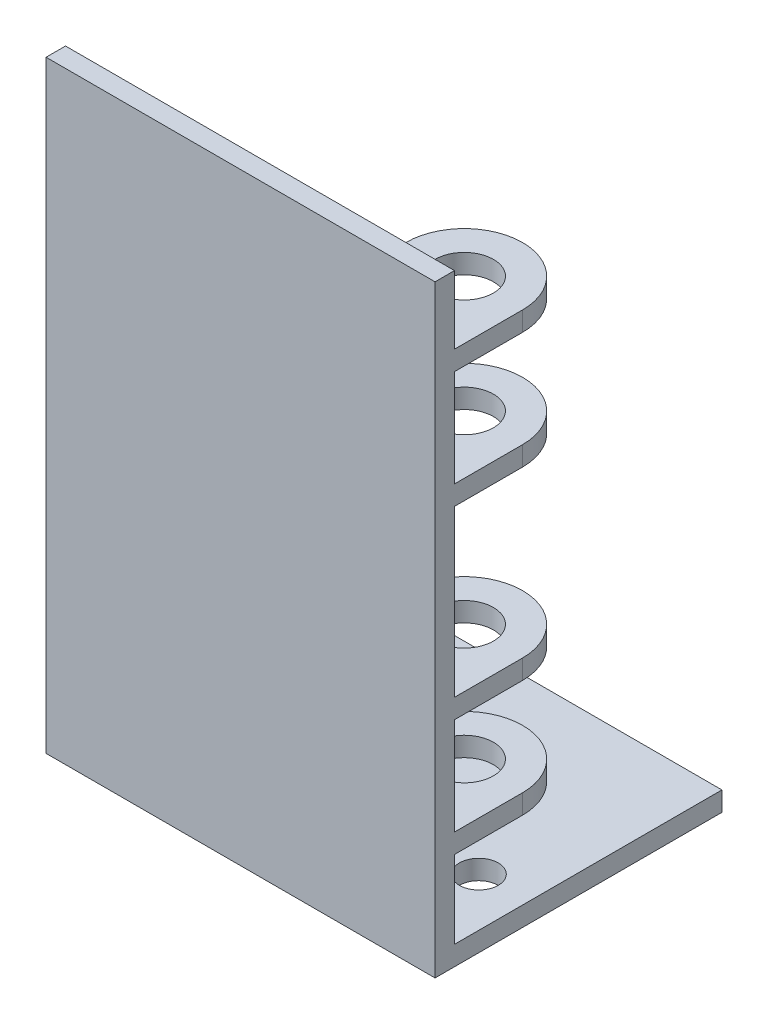
ISO-10303-21;
HEADER;
FILE_DESCRIPTION(('STEP AP214'),'2;1');
FILE_NAME('part.step','',(''),(''),'','','');
FILE_SCHEMA(('AUTOMOTIVE_DESIGN { 1 0 10303 214 1 1 1 1 }'));
ENDSEC;
DATA;
#1=APPLICATION_CONTEXT('core data for automotive mechanical design processes');
#2=APPLICATION_PROTOCOL_DEFINITION('international standard','automotive_design',2000,#1);
#3=PRODUCT_CONTEXT('',#1,'mechanical');
#4=PRODUCT('Part','Part','',(#3));
#5=PRODUCT_RELATED_PRODUCT_CATEGORY('part','',(#4));
#6=PRODUCT_DEFINITION_FORMATION('','',#4);
#7=PRODUCT_DEFINITION_CONTEXT('part definition',#1,'design');
#8=PRODUCT_DEFINITION('design','',#6,#7);
#9=PRODUCT_DEFINITION_SHAPE('','',#8);
#10=(LENGTH_UNIT() NAMED_UNIT(*) SI_UNIT(.MILLI.,.METRE.));
#11=(NAMED_UNIT(*) PLANE_ANGLE_UNIT() SI_UNIT($,.RADIAN.));
#12=(NAMED_UNIT(*) SI_UNIT($,.STERADIAN.) SOLID_ANGLE_UNIT());
#13=UNCERTAINTY_MEASURE_WITH_UNIT(LENGTH_MEASURE(1.E-05),#10,'distance_accuracy_value','');
#14=(GEOMETRIC_REPRESENTATION_CONTEXT(3) GLOBAL_UNCERTAINTY_ASSIGNED_CONTEXT((#13)) GLOBAL_UNIT_ASSIGNED_CONTEXT((#10,
#11,#12)) REPRESENTATION_CONTEXT('',''));
#15=CARTESIAN_POINT('',(0.,0.,0.));
#16=DIRECTION('',(0.,0.,1.));
#17=DIRECTION('',(1.,0.,0.));
#18=AXIS2_PLACEMENT_3D('',#15,#16,#17);
#19=CARTESIAN_POINT('',(0.,2.,0.));
#20=DIRECTION('',(0.,-1.,0.));
#21=DIRECTION('',(0.,0.,-1.));
#22=AXIS2_PLACEMENT_3D('',#19,#20,#21);
#23=PLANE('',#22);
#24=DIRECTION('',(0.,0.,-1.));
#25=VECTOR('',#24,1.);
#26=CARTESIAN_POINT('',(40.,2.,0.));
#27=LINE('',#26,#25);
#28=CARTESIAN_POINT('',(40.,2.,0.));
#29=VERTEX_POINT('',#28);
#30=CARTESIAN_POINT('',(40.,2.,-27.4999999999999));
#31=VERTEX_POINT('',#30);
#32=EDGE_CURVE('E11',#29,#31,#27,.T.);
#33=ORIENTED_EDGE('',*,*,#32,.T.);
#34=DIRECTION('',(1.,0.,0.));
#35=VECTOR('',#34,1.);
#36=CARTESIAN_POINT('',(0.,2.,-27.4999999999999));
#37=LINE('',#36,#35);
#38=CARTESIAN_POINT('',(0.,2.,-27.4999999999999));
#39=VERTEX_POINT('',#38);
#40=EDGE_CURVE('E269',#39,#31,#37,.T.);
#41=ORIENTED_EDGE('',*,*,#40,.F.);
#42=DIRECTION('',(0.,0.,1.));
#43=VECTOR('',#42,1.);
#44=CARTESIAN_POINT('',(0.,2.,0.));
#45=LINE('',#44,#43);
#46=CARTESIAN_POINT('',(0.,2.00000000000002,0.));
#47=VERTEX_POINT('',#46);
#48=EDGE_CURVE('E386',#39,#47,#45,.T.);
#49=ORIENTED_EDGE('',*,*,#48,.T.);
#50=DIRECTION('',(1.,0.,0.));
#51=VECTOR('',#50,1.);
#52=CARTESIAN_POINT('',(0.,2.,0.));
#53=LINE('',#52,#51);
#54=EDGE_CURVE('E52',#47,#29,#53,.T.);
#55=ORIENTED_EDGE('',*,*,#54,.T.);
#56=EDGE_LOOP('',(#33,#41,#49,#55));
#57=FACE_BOUND('',#56,.T.);
#58=CARTESIAN_POINT('',(35.,2.,-7.5));
#59=DIRECTION('',(0.,1.,0.));
#60=DIRECTION('',(0.,0.,1.));
#61=AXIS2_PLACEMENT_3D('',#58,#59,#60);
#62=CIRCLE('',#61,2.);
#63=CARTESIAN_POINT('',(35.,2.,-5.5));
#64=VERTEX_POINT('',#63);
#65=EDGE_CURVE('E379',#64,#64,#62,.T.);
#66=ORIENTED_EDGE('',*,*,#65,.F.);
#67=EDGE_LOOP('',(#66));
#68=FACE_BOUND('',#67,.T.);
#69=CARTESIAN_POINT('',(5.,2.,-7.5));
#70=DIRECTION('',(0.,1.,0.));
#71=DIRECTION('',(0.,0.,1.));
#72=AXIS2_PLACEMENT_3D('',#69,#70,#71);
#73=CIRCLE('',#72,2.);
#74=CARTESIAN_POINT('',(5.,2.,-5.5));
#75=VERTEX_POINT('',#74);
#76=EDGE_CURVE('E372',#75,#75,#73,.T.);
#77=ORIENTED_EDGE('',*,*,#76,.F.);
#78=EDGE_LOOP('',(#77));
#79=FACE_BOUND('',#78,.T.);
#80=ADVANCED_FACE('F43',(#57,#68,#79),#23,.F.);
#81=CARTESIAN_POINT('',(0.,0.,0.));
#82=DIRECTION('',(0.,-1.,0.));
#83=DIRECTION('',(0.,0.,-1.));
#84=AXIS2_PLACEMENT_3D('',#81,#82,#83);
#85=PLANE('',#84);
#86=DIRECTION('',(1.,0.,0.));
#87=VECTOR('',#86,1.);
#88=CARTESIAN_POINT('',(0.,0.,-27.4999999999999));
#89=LINE('',#88,#87);
#90=CARTESIAN_POINT('',(0.,0.,-27.4999999999999));
#91=VERTEX_POINT('',#90);
#92=CARTESIAN_POINT('',(40.,0.,-27.4999999999999));
#93=VERTEX_POINT('',#92);
#94=EDGE_CURVE('E270',#91,#93,#89,.T.);
#95=ORIENTED_EDGE('',*,*,#94,.T.);
#96=DIRECTION('',(0.,0.,-1.));
#97=VECTOR('',#96,1.);
#98=CARTESIAN_POINT('',(40.,0.,0.));
#99=LINE('',#98,#97);
#100=CARTESIAN_POINT('',(40.,0.,2.));
#101=VERTEX_POINT('',#100);
#102=EDGE_CURVE('E47',#101,#93,#99,.T.);
#103=ORIENTED_EDGE('',*,*,#102,.F.);
#104=DIRECTION('',(1.,0.,0.));
#105=VECTOR('',#104,1.);
#106=CARTESIAN_POINT('',(0.,0.,2.));
#107=LINE('',#106,#105);
#108=CARTESIAN_POINT('',(0.,0.,2.));
#109=VERTEX_POINT('',#108);
#110=EDGE_CURVE('E353',#109,#101,#107,.T.);
#111=ORIENTED_EDGE('',*,*,#110,.F.);
#112=DIRECTION('',(0.,0.,1.));
#113=VECTOR('',#112,1.);
#114=CARTESIAN_POINT('',(0.,0.,0.));
#115=LINE('',#114,#113);
#116=EDGE_CURVE('E383',#91,#109,#115,.T.);
#117=ORIENTED_EDGE('',*,*,#116,.F.);
#118=EDGE_LOOP('',(#95,#103,#111,#117));
#119=FACE_BOUND('',#118,.T.);
#120=CARTESIAN_POINT('',(35.,0.,-7.5));
#121=DIRECTION('',(0.,1.,0.));
#122=DIRECTION('',(0.,0.,1.));
#123=AXIS2_PLACEMENT_3D('',#120,#121,#122);
#124=CIRCLE('',#123,2.);
#125=CARTESIAN_POINT('',(35.,0.,-5.5));
#126=VERTEX_POINT('',#125);
#127=EDGE_CURVE('E376',#126,#126,#124,.T.);
#128=ORIENTED_EDGE('',*,*,#127,.T.);
#129=EDGE_LOOP('',(#128));
#130=FACE_BOUND('',#129,.T.);
#131=CARTESIAN_POINT('',(5.,0.,-7.5));
#132=DIRECTION('',(0.,1.,0.));
#133=DIRECTION('',(0.,0.,1.));
#134=AXIS2_PLACEMENT_3D('',#131,#132,#133);
#135=CIRCLE('',#134,2.);
#136=CARTESIAN_POINT('',(5.,0.,-5.5));
#137=VERTEX_POINT('',#136);
#138=EDGE_CURVE('E371',#137,#137,#135,.T.);
#139=ORIENTED_EDGE('',*,*,#138,.T.);
#140=EDGE_LOOP('',(#139));
#141=FACE_BOUND('',#140,.T.);
#142=ADVANCED_FACE('F399',(#119,#130,#141),#85,.T.);
#143=CARTESIAN_POINT('',(0.,2.,0.));
#144=DIRECTION('',(1.,0.,0.));
#145=DIRECTION('',(0.,0.,-1.));
#146=AXIS2_PLACEMENT_3D('',#143,#144,#145);
#147=PLANE('',#146);
#148=ORIENTED_EDGE('',*,*,#48,.F.);
#149=DIRECTION('',(0.,1.,0.));
#150=VECTOR('',#149,1.);
#151=CARTESIAN_POINT('',(0.,0.,-27.4999999999999));
#152=LINE('',#151,#150);
#153=EDGE_CURVE('E273',#91,#39,#152,.T.);
#154=ORIENTED_EDGE('',*,*,#153,.F.);
#155=ORIENTED_EDGE('',*,*,#116,.T.);
#156=DIRECTION('',(0.,-1.,0.));
#157=VECTOR('',#156,1.);
#158=CARTESIAN_POINT('',(0.,42.,2.));
#159=LINE('',#158,#157);
#160=CARTESIAN_POINT('',(0.,62.,2.));
#161=VERTEX_POINT('',#160);
#162=EDGE_CURVE('E368',#161,#109,#159,.T.);
#163=ORIENTED_EDGE('',*,*,#162,.F.);
#164=DIRECTION('',(0.,0.,1.));
#165=VECTOR('',#164,1.);
#166=CARTESIAN_POINT('',(0.,62.,0.));
#167=LINE('',#166,#165);
#168=CARTESIAN_POINT('',(0.,62.,0.));
#169=VERTEX_POINT('',#168);
#170=EDGE_CURVE('E260',#169,#161,#167,.T.);
#171=ORIENTED_EDGE('',*,*,#170,.F.);
#172=DIRECTION('',(0.,-1.,0.));
#173=VECTOR('',#172,1.);
#174=CARTESIAN_POINT('',(0.,42.,0.));
#175=LINE('',#174,#173);
#176=EDGE_CURVE('E356',#169,#47,#175,.T.);
#177=ORIENTED_EDGE('',*,*,#176,.T.);
#178=EDGE_LOOP('',(#148,#154,#155,#163,#171,#177));
#179=FACE_BOUND('',#178,.T.);
#180=ADVANCED_FACE('F45',(#179),#147,.F.);
#181=CARTESIAN_POINT('',(40.,2.,0.));
#182=DIRECTION('',(-1.,0.,0.));
#183=DIRECTION('',(0.,0.,1.));
#184=AXIS2_PLACEMENT_3D('',#181,#182,#183);
#185=PLANE('',#184);
#186=ORIENTED_EDGE('',*,*,#102,.T.);
#187=DIRECTION('',(0.,1.,0.));
#188=VECTOR('',#187,1.);
#189=CARTESIAN_POINT('',(40.,0.,-27.4999999999999));
#190=LINE('',#189,#188);
#191=EDGE_CURVE('E275',#93,#31,#190,.T.);
#192=ORIENTED_EDGE('',*,*,#191,.T.);
#193=ORIENTED_EDGE('',*,*,#32,.F.);
#194=DIRECTION('',(0.,-1.,0.));
#195=VECTOR('',#194,1.);
#196=CARTESIAN_POINT('',(40.,42.,0.));
#197=LINE('',#196,#195);
#198=CARTESIAN_POINT('',(40.,10.,0.));
#199=VERTEX_POINT('',#198);
#200=EDGE_CURVE('E359',#199,#29,#197,.T.);
#201=ORIENTED_EDGE('',*,*,#200,.F.);
#202=DIRECTION('',(0.,0.,-1.));
#203=VECTOR('',#202,1.);
#204=CARTESIAN_POINT('',(40.,10.,-7.));
#205=LINE('',#204,#203);
#206=CARTESIAN_POINT('',(40.,10.,-7.));
#207=VERTEX_POINT('',#206);
#208=EDGE_CURVE('E290',#199,#207,#205,.T.);
#209=ORIENTED_EDGE('',*,*,#208,.T.);
#210=DIRECTION('',(0.,-1.,0.));
#211=VECTOR('',#210,1.);
#212=CARTESIAN_POINT('',(40.,12.,-7.));
#213=LINE('',#212,#211);
#214=CARTESIAN_POINT('',(40.,12.,-7.));
#215=VERTEX_POINT('',#214);
#216=EDGE_CURVE('E298',#215,#207,#213,.T.);
#217=ORIENTED_EDGE('',*,*,#216,.F.);
#218=DIRECTION('',(0.,0.,-1.));
#219=VECTOR('',#218,1.);
#220=CARTESIAN_POINT('',(40.,12.,-7.));
#221=LINE('',#220,#219);
#222=CARTESIAN_POINT('',(40.,12.,0.));
#223=VERTEX_POINT('',#222);
#224=EDGE_CURVE('E296',#223,#215,#221,.T.);
#225=ORIENTED_EDGE('',*,*,#224,.F.);
#226=CARTESIAN_POINT('',(40.,22.,0.));
#227=VERTEX_POINT('',#226);
#228=EDGE_CURVE('E365',#227,#223,#197,.T.);
#229=ORIENTED_EDGE('',*,*,#228,.F.);
#230=DIRECTION('',(0.,0.,-1.));
#231=VECTOR('',#230,1.);
#232=CARTESIAN_POINT('',(40.,22.,-7.));
#233=LINE('',#232,#231);
#234=CARTESIAN_POINT('',(40.,22.,-7.));
#235=VERTEX_POINT('',#234);
#236=EDGE_CURVE('E328',#227,#235,#233,.T.);
#237=ORIENTED_EDGE('',*,*,#236,.T.);
#238=DIRECTION('',(0.,-1.,0.));
#239=VECTOR('',#238,1.);
#240=CARTESIAN_POINT('',(40.,24.,-7.));
#241=LINE('',#240,#239);
#242=CARTESIAN_POINT('',(40.,24.,-7.));
#243=VERTEX_POINT('',#242);
#244=EDGE_CURVE('E336',#243,#235,#241,.T.);
#245=ORIENTED_EDGE('',*,*,#244,.F.);
#246=DIRECTION('',(0.,0.,-1.));
#247=VECTOR('',#246,1.);
#248=CARTESIAN_POINT('',(40.,24.,-7.));
#249=LINE('',#248,#247);
#250=CARTESIAN_POINT('',(40.,24.,0.));
#251=VERTEX_POINT('',#250);
#252=EDGE_CURVE('E334',#251,#243,#249,.T.);
#253=ORIENTED_EDGE('',*,*,#252,.F.);
#254=CARTESIAN_POINT('',(40.,41.,0.));
#255=VERTEX_POINT('',#254);
#256=EDGE_CURVE('E364',#255,#251,#197,.T.);
#257=ORIENTED_EDGE('',*,*,#256,.F.);
#258=DIRECTION('',(0.,0.,-1.));
#259=VECTOR('',#258,1.);
#260=CARTESIAN_POINT('',(40.,41.,-7.));
#261=LINE('',#260,#259);
#262=CARTESIAN_POINT('',(40.,41.,-7.));
#263=VERTEX_POINT('',#262);
#264=EDGE_CURVE('E210',#255,#263,#261,.T.);
#265=ORIENTED_EDGE('',*,*,#264,.T.);
#266=DIRECTION('',(0.,-1.,0.));
#267=VECTOR('',#266,1.);
#268=CARTESIAN_POINT('',(40.,43.,-7.));
#269=LINE('',#268,#267);
#270=CARTESIAN_POINT('',(40.,43.,-7.));
#271=VERTEX_POINT('',#270);
#272=EDGE_CURVE('E220',#271,#263,#269,.T.);
#273=ORIENTED_EDGE('',*,*,#272,.F.);
#274=DIRECTION('',(0.,0.,-1.));
#275=VECTOR('',#274,1.);
#276=CARTESIAN_POINT('',(40.,43.,-7.));
#277=LINE('',#276,#275);
#278=CARTESIAN_POINT('',(40.,43.,0.));
#279=VERTEX_POINT('',#278);
#280=EDGE_CURVE('E206',#279,#271,#277,.T.);
#281=ORIENTED_EDGE('',*,*,#280,.F.);
#282=CARTESIAN_POINT('',(40.,53.,0.));
#283=VERTEX_POINT('',#282);
#284=EDGE_CURVE('E363',#283,#279,#197,.T.);
#285=ORIENTED_EDGE('',*,*,#284,.F.);
#286=DIRECTION('',(0.,0.,-1.));
#287=VECTOR('',#286,1.);
#288=CARTESIAN_POINT('',(40.,53.,-7.));
#289=LINE('',#288,#287);
#290=CARTESIAN_POINT('',(40.,53.,-7.));
#291=VERTEX_POINT('',#290);
#292=EDGE_CURVE('E232',#283,#291,#289,.T.);
#293=ORIENTED_EDGE('',*,*,#292,.T.);
#294=DIRECTION('',(0.,-1.,0.));
#295=VECTOR('',#294,1.);
#296=CARTESIAN_POINT('',(40.,55.,-7.));
#297=LINE('',#296,#295);
#298=CARTESIAN_POINT('',(40.,55.,-7.));
#299=VERTEX_POINT('',#298);
#300=EDGE_CURVE('E240',#299,#291,#297,.T.);
#301=ORIENTED_EDGE('',*,*,#300,.F.);
#302=DIRECTION('',(0.,0.,-1.));
#303=VECTOR('',#302,1.);
#304=CARTESIAN_POINT('',(40.,55.,-7.));
#305=LINE('',#304,#303);
#306=CARTESIAN_POINT('',(40.,55.,0.));
#307=VERTEX_POINT('',#306);
#308=EDGE_CURVE('E238',#307,#299,#305,.T.);
#309=ORIENTED_EDGE('',*,*,#308,.F.);
#310=CARTESIAN_POINT('',(40.,62.,0.));
#311=VERTEX_POINT('',#310);
#312=EDGE_CURVE('E360',#311,#307,#197,.T.);
#313=ORIENTED_EDGE('',*,*,#312,.F.);
#314=DIRECTION('',(0.,0.,-1.));
#315=VECTOR('',#314,1.);
#316=CARTESIAN_POINT('',(40.,62.,2.));
#317=LINE('',#316,#315);
#318=CARTESIAN_POINT('',(40.,62.,2.));
#319=VERTEX_POINT('',#318);
#320=EDGE_CURVE('E266',#319,#311,#317,.T.);
#321=ORIENTED_EDGE('',*,*,#320,.F.);
#322=DIRECTION('',(0.,-1.,0.));
#323=VECTOR('',#322,1.);
#324=CARTESIAN_POINT('',(40.,42.,2.));
#325=LINE('',#324,#323);
#326=EDGE_CURVE('E362',#319,#101,#325,.T.);
#327=ORIENTED_EDGE('',*,*,#326,.T.);
#328=EDGE_LOOP('',(#186,#192,#193,#201,#209,#217,#225,#229,#237,#245,#253,#257,#265,#273,#281,
#285,#293,#301,#309,#313,#321,#327));
#329=FACE_BOUND('',#328,.T.);
#330=ADVANCED_FACE('F395',(#329),#185,.F.);
#331=CARTESIAN_POINT('',(35.,2.,-7.5));
#332=DIRECTION('',(0.,-1.,0.));
#333=DIRECTION('',(0.,0.,-1.));
#334=AXIS2_PLACEMENT_3D('',#331,#332,#333);
#335=CYLINDRICAL_SURFACE('',#334,2.);
#336=ORIENTED_EDGE('',*,*,#65,.T.);
#337=EDGE_LOOP('',(#336));
#338=FACE_BOUND('',#337,.T.);
#339=ORIENTED_EDGE('',*,*,#127,.F.);
#340=EDGE_LOOP('',(#339));
#341=FACE_BOUND('',#340,.T.);
#342=ADVANCED_FACE('F435',(#338,#341),#335,.F.);
#343=CARTESIAN_POINT('',(5.,2.,-7.5));
#344=DIRECTION('',(0.,-1.,0.));
#345=DIRECTION('',(0.,0.,-1.));
#346=AXIS2_PLACEMENT_3D('',#343,#344,#345);
#347=CYLINDRICAL_SURFACE('',#346,2.);
#348=ORIENTED_EDGE('',*,*,#76,.T.);
#349=EDGE_LOOP('',(#348));
#350=FACE_BOUND('',#349,.T.);
#351=ORIENTED_EDGE('',*,*,#138,.F.);
#352=EDGE_LOOP('',(#351));
#353=FACE_BOUND('',#352,.T.);
#354=ADVANCED_FACE('F442',(#350,#353),#347,.F.);
#355=CARTESIAN_POINT('',(0.,42.,2.));
#356=DIRECTION('',(0.,0.,-1.));
#357=DIRECTION('',(-1.,0.,0.));
#358=AXIS2_PLACEMENT_3D('',#355,#356,#357);
#359=PLANE('',#358);
#360=ORIENTED_EDGE('',*,*,#110,.T.);
#361=ORIENTED_EDGE('',*,*,#326,.F.);
#362=DIRECTION('',(1.,0.,0.));
#363=VECTOR('',#362,1.);
#364=CARTESIAN_POINT('',(0.,62.,2.));
#365=LINE('',#364,#363);
#366=EDGE_CURVE('E263',#161,#319,#365,.T.);
#367=ORIENTED_EDGE('',*,*,#366,.F.);
#368=ORIENTED_EDGE('',*,*,#162,.T.);
#369=EDGE_LOOP('',(#360,#361,#367,#368));
#370=FACE_BOUND('',#369,.T.);
#371=ADVANCED_FACE('F402',(#370),#359,.F.);
#372=CARTESIAN_POINT('',(0.,42.,0.));
#373=DIRECTION('',(0.,0.,1.));
#374=DIRECTION('',(1.,0.,0.));
#375=AXIS2_PLACEMENT_3D('',#372,#373,#374);
#376=PLANE('',#375);
#377=ORIENTED_EDGE('',*,*,#284,.T.);
#378=DIRECTION('',(1.,0.,0.));
#379=VECTOR('',#378,1.);
#380=CARTESIAN_POINT('',(40.,43.,0.));
#381=LINE('',#380,#379);
#382=CARTESIAN_POINT('',(28.,43.,0.));
#383=VERTEX_POINT('',#382);
#384=EDGE_CURVE('E60',#383,#279,#381,.T.);
#385=ORIENTED_EDGE('',*,*,#384,.F.);
#386=DIRECTION('',(0.,-1.,0.));
#387=VECTOR('',#386,1.);
#388=CARTESIAN_POINT('',(28.,43.,0.));
#389=LINE('',#388,#387);
#390=CARTESIAN_POINT('',(28.,41.,0.));
#391=VERTEX_POINT('',#390);
#392=EDGE_CURVE('E65',#383,#391,#389,.T.);
#393=ORIENTED_EDGE('',*,*,#392,.T.);
#394=DIRECTION('',(1.,0.,0.));
#395=VECTOR('',#394,1.);
#396=CARTESIAN_POINT('',(40.,41.,0.));
#397=LINE('',#396,#395);
#398=EDGE_CURVE('E814',#391,#255,#397,.T.);
#399=ORIENTED_EDGE('',*,*,#398,.T.);
#400=ORIENTED_EDGE('',*,*,#256,.T.);
#401=DIRECTION('',(1.,0.,0.));
#402=VECTOR('',#401,1.);
#403=CARTESIAN_POINT('',(40.,24.,0.));
#404=LINE('',#403,#402);
#405=CARTESIAN_POINT('',(28.,24.,0.));
#406=VERTEX_POINT('',#405);
#407=EDGE_CURVE('E331',#406,#251,#404,.T.);
#408=ORIENTED_EDGE('',*,*,#407,.F.);
#409=DIRECTION('',(0.,-1.,0.));
#410=VECTOR('',#409,1.);
#411=CARTESIAN_POINT('',(28.,24.,0.));
#412=LINE('',#411,#410);
#413=CARTESIAN_POINT('',(28.,22.,0.));
#414=VERTEX_POINT('',#413);
#415=EDGE_CURVE('E348',#406,#414,#412,.T.);
#416=ORIENTED_EDGE('',*,*,#415,.T.);
#417=DIRECTION('',(1.,0.,0.));
#418=VECTOR('',#417,1.);
#419=CARTESIAN_POINT('',(40.,22.,0.));
#420=LINE('',#419,#418);
#421=EDGE_CURVE('E342',#414,#227,#420,.T.);
#422=ORIENTED_EDGE('',*,*,#421,.T.);
#423=ORIENTED_EDGE('',*,*,#228,.T.);
#424=DIRECTION('',(1.,0.,0.));
#425=VECTOR('',#424,1.);
#426=CARTESIAN_POINT('',(40.,12.,0.));
#427=LINE('',#426,#425);
#428=CARTESIAN_POINT('',(28.,12.,0.));
#429=VERTEX_POINT('',#428);
#430=EDGE_CURVE('E293',#429,#223,#427,.T.);
#431=ORIENTED_EDGE('',*,*,#430,.F.);
#432=DIRECTION('',(0.,-1.,0.));
#433=VECTOR('',#432,1.);
#434=CARTESIAN_POINT('',(28.,12.,0.));
#435=LINE('',#434,#433);
#436=CARTESIAN_POINT('',(28.,10.,0.));
#437=VERTEX_POINT('',#436);
#438=EDGE_CURVE('E310',#429,#437,#435,.T.);
#439=ORIENTED_EDGE('',*,*,#438,.T.);
#440=DIRECTION('',(1.,0.,0.));
#441=VECTOR('',#440,1.);
#442=CARTESIAN_POINT('',(40.,10.,0.));
#443=LINE('',#442,#441);
#444=EDGE_CURVE('E304',#437,#199,#443,.T.);
#445=ORIENTED_EDGE('',*,*,#444,.T.);
#446=ORIENTED_EDGE('',*,*,#200,.T.);
#447=ORIENTED_EDGE('',*,*,#54,.F.);
#448=ORIENTED_EDGE('',*,*,#176,.F.);
#449=DIRECTION('',(-1.,0.,0.));
#450=VECTOR('',#449,1.);
#451=CARTESIAN_POINT('',(40.,62.,0.));
#452=LINE('',#451,#450);
#453=EDGE_CURVE('E257',#311,#169,#452,.T.);
#454=ORIENTED_EDGE('',*,*,#453,.F.);
#455=ORIENTED_EDGE('',*,*,#312,.T.);
#456=DIRECTION('',(1.,0.,0.));
#457=VECTOR('',#456,1.);
#458=CARTESIAN_POINT('',(40.,55.,0.));
#459=LINE('',#458,#457);
#460=CARTESIAN_POINT('',(28.,55.,0.));
#461=VERTEX_POINT('',#460);
#462=EDGE_CURVE('E235',#461,#307,#459,.T.);
#463=ORIENTED_EDGE('',*,*,#462,.F.);
#464=DIRECTION('',(0.,-1.,0.));
#465=VECTOR('',#464,1.);
#466=CARTESIAN_POINT('',(28.,55.,0.));
#467=LINE('',#466,#465);
#468=CARTESIAN_POINT('',(28.,53.,0.));
#469=VERTEX_POINT('',#468);
#470=EDGE_CURVE('E252',#461,#469,#467,.T.);
#471=ORIENTED_EDGE('',*,*,#470,.T.);
#472=DIRECTION('',(1.,0.,0.));
#473=VECTOR('',#472,1.);
#474=CARTESIAN_POINT('',(40.,53.,0.));
#475=LINE('',#474,#473);
#476=EDGE_CURVE('E246',#469,#283,#475,.T.);
#477=ORIENTED_EDGE('',*,*,#476,.T.);
#478=EDGE_LOOP('',(#377,#385,#393,#399,#400,#408,#416,#422,#423,#431,#439,#445,#446,#447,#448,
#454,#455,#463,#471,#477));
#479=FACE_BOUND('',#478,.T.);
#480=ADVANCED_FACE('F409',(#479),#376,.F.);
#481=CARTESIAN_POINT('',(34.,24.,-7.));
#482=DIRECTION('',(0.,1.,0.));
#483=DIRECTION('',(0.,0.,1.));
#484=AXIS2_PLACEMENT_3D('',#481,#482,#483);
#485=PLANE('',#484);
#486=CARTESIAN_POINT('',(34.,24.,-7.));
#487=DIRECTION('',(0.,1.,0.));
#488=DIRECTION('',(0.,0.,1.));
#489=AXIS2_PLACEMENT_3D('',#486,#487,#488);
#490=CIRCLE('',#489,6.);
#491=CARTESIAN_POINT('',(28.,24.,-7.));
#492=VERTEX_POINT('',#491);
#493=EDGE_CURVE('E323',#243,#492,#490,.T.);
#494=ORIENTED_EDGE('',*,*,#493,.T.);
#495=DIRECTION('',(0.,0.,1.));
#496=VECTOR('',#495,1.);
#497=CARTESIAN_POINT('',(28.,24.,0.));
#498=LINE('',#497,#496);
#499=EDGE_CURVE('E327',#492,#406,#498,.T.);
#500=ORIENTED_EDGE('',*,*,#499,.T.);
#501=ORIENTED_EDGE('',*,*,#407,.T.);
#502=ORIENTED_EDGE('',*,*,#252,.T.);
#503=EDGE_LOOP('',(#494,#500,#501,#502));
#504=FACE_BOUND('',#503,.T.);
#505=CARTESIAN_POINT('',(34.,24.,-7.));
#506=DIRECTION('',(0.,1.,0.));
#507=DIRECTION('',(0.,0.,1.));
#508=AXIS2_PLACEMENT_3D('',#505,#506,#507);
#509=CIRCLE('',#508,3.);
#510=CARTESIAN_POINT('',(34.,24.,-4.));
#511=VERTEX_POINT('',#510);
#512=EDGE_CURVE('E316',#511,#511,#509,.T.);
#513=ORIENTED_EDGE('',*,*,#512,.F.);
#514=EDGE_LOOP('',(#513));
#515=FACE_BOUND('',#514,.T.);
#516=ADVANCED_FACE('F473',(#504,#515),#485,.T.);
#517=CARTESIAN_POINT('',(34.,22.,-7.));
#518=DIRECTION('',(0.,1.,0.));
#519=DIRECTION('',(0.,0.,1.));
#520=AXIS2_PLACEMENT_3D('',#517,#518,#519);
#521=PLANE('',#520);
#522=CARTESIAN_POINT('',(34.,22.,-7.));
#523=DIRECTION('',(0.,1.,0.));
#524=DIRECTION('',(0.,0.,1.));
#525=AXIS2_PLACEMENT_3D('',#522,#523,#524);
#526=CIRCLE('',#525,6.);
#527=CARTESIAN_POINT('',(28.,22.,-7.));
#528=VERTEX_POINT('',#527);
#529=EDGE_CURVE('E320',#235,#528,#526,.T.);
#530=ORIENTED_EDGE('',*,*,#529,.F.);
#531=ORIENTED_EDGE('',*,*,#236,.F.);
#532=ORIENTED_EDGE('',*,*,#421,.F.);
#533=DIRECTION('',(0.,0.,1.));
#534=VECTOR('',#533,1.);
#535=CARTESIAN_POINT('',(28.,22.,0.));
#536=LINE('',#535,#534);
#537=EDGE_CURVE('E339',#528,#414,#536,.T.);
#538=ORIENTED_EDGE('',*,*,#537,.F.);
#539=EDGE_LOOP('',(#530,#531,#532,#538));
#540=FACE_BOUND('',#539,.T.);
#541=CARTESIAN_POINT('',(34.,22.,-7.));
#542=DIRECTION('',(0.,1.,0.));
#543=DIRECTION('',(0.,0.,1.));
#544=AXIS2_PLACEMENT_3D('',#541,#542,#543);
#545=CIRCLE('',#544,3.);
#546=CARTESIAN_POINT('',(34.,22.,-4.));
#547=VERTEX_POINT('',#546);
#548=EDGE_CURVE('E315',#547,#547,#545,.T.);
#549=ORIENTED_EDGE('',*,*,#548,.T.);
#550=EDGE_LOOP('',(#549));
#551=FACE_BOUND('',#550,.T.);
#552=ADVANCED_FACE('F477',(#540,#551),#521,.F.);
#553=CARTESIAN_POINT('',(34.,24.,-7.));
#554=DIRECTION('',(0.,-1.,0.));
#555=DIRECTION('',(0.,0.,-1.));
#556=AXIS2_PLACEMENT_3D('',#553,#554,#555);
#557=CYLINDRICAL_SURFACE('',#556,6.);
#558=ORIENTED_EDGE('',*,*,#529,.T.);
#559=DIRECTION('',(0.,-1.,0.));
#560=VECTOR('',#559,1.);
#561=CARTESIAN_POINT('',(28.,24.,-7.));
#562=LINE('',#561,#560);
#563=EDGE_CURVE('E350',#492,#528,#562,.T.);
#564=ORIENTED_EDGE('',*,*,#563,.F.);
#565=ORIENTED_EDGE('',*,*,#493,.F.);
#566=ORIENTED_EDGE('',*,*,#244,.T.);
#567=EDGE_LOOP('',(#558,#564,#565,#566));
#568=FACE_BOUND('',#567,.T.);
#569=ADVANCED_FACE('F497',(#568),#557,.T.);
#570=CARTESIAN_POINT('',(28.,24.,0.));
#571=DIRECTION('',(1.,0.,0.));
#572=DIRECTION('',(0.,0.,-1.));
#573=AXIS2_PLACEMENT_3D('',#570,#571,#572);
#574=PLANE('',#573);
#575=ORIENTED_EDGE('',*,*,#537,.T.);
#576=ORIENTED_EDGE('',*,*,#415,.F.);
#577=ORIENTED_EDGE('',*,*,#499,.F.);
#578=ORIENTED_EDGE('',*,*,#563,.T.);
#579=EDGE_LOOP('',(#575,#576,#577,#578));
#580=FACE_BOUND('',#579,.T.);
#581=ADVANCED_FACE('F463',(#580),#574,.F.);
#582=CARTESIAN_POINT('',(34.,24.,-7.));
#583=DIRECTION('',(0.,-1.,0.));
#584=DIRECTION('',(0.,0.,-1.));
#585=AXIS2_PLACEMENT_3D('',#582,#583,#584);
#586=CYLINDRICAL_SURFACE('',#585,3.);
#587=ORIENTED_EDGE('',*,*,#512,.T.);
#588=EDGE_LOOP('',(#587));
#589=FACE_BOUND('',#588,.T.);
#590=ORIENTED_EDGE('',*,*,#548,.F.);
#591=EDGE_LOOP('',(#590));
#592=FACE_BOUND('',#591,.T.);
#593=ADVANCED_FACE('F458',(#589,#592),#586,.F.);
#594=CARTESIAN_POINT('',(34.,12.,-7.));
#595=DIRECTION('',(0.,1.,0.));
#596=DIRECTION('',(0.,0.,1.));
#597=AXIS2_PLACEMENT_3D('',#594,#595,#596);
#598=PLANE('',#597);
#599=CARTESIAN_POINT('',(34.,12.,-7.));
#600=DIRECTION('',(0.,1.,0.));
#601=DIRECTION('',(0.,0.,1.));
#602=AXIS2_PLACEMENT_3D('',#599,#600,#601);
#603=CIRCLE('',#602,6.);
#604=CARTESIAN_POINT('',(28.,12.,-7.));
#605=VERTEX_POINT('',#604);
#606=EDGE_CURVE('E286',#215,#605,#603,.T.);
#607=ORIENTED_EDGE('',*,*,#606,.T.);
#608=DIRECTION('',(0.,0.,1.));
#609=VECTOR('',#608,1.);
#610=CARTESIAN_POINT('',(28.,12.,0.));
#611=LINE('',#610,#609);
#612=EDGE_CURVE('E289',#605,#429,#611,.T.);
#613=ORIENTED_EDGE('',*,*,#612,.T.);
#614=ORIENTED_EDGE('',*,*,#430,.T.);
#615=ORIENTED_EDGE('',*,*,#224,.T.);
#616=EDGE_LOOP('',(#607,#613,#614,#615));
#617=FACE_BOUND('',#616,.T.);
#618=CARTESIAN_POINT('',(34.,12.,-7.));
#619=DIRECTION('',(0.,1.,0.));
#620=DIRECTION('',(0.,0.,1.));
#621=AXIS2_PLACEMENT_3D('',#618,#619,#620);
#622=CIRCLE('',#621,3.);
#623=CARTESIAN_POINT('',(34.,12.,-4.));
#624=VERTEX_POINT('',#623);
#625=EDGE_CURVE('E280',#624,#624,#622,.T.);
#626=ORIENTED_EDGE('',*,*,#625,.F.);
#627=EDGE_LOOP('',(#626));
#628=FACE_BOUND('',#627,.T.);
#629=ADVANCED_FACE('F462',(#617,#628),#598,.T.);
#630=CARTESIAN_POINT('',(34.,10.,-7.));
#631=DIRECTION('',(0.,1.,0.));
#632=DIRECTION('',(0.,0.,1.));
#633=AXIS2_PLACEMENT_3D('',#630,#631,#632);
#634=PLANE('',#633);
#635=CARTESIAN_POINT('',(34.,10.,-7.));
#636=DIRECTION('',(0.,1.,0.));
#637=DIRECTION('',(0.,0.,1.));
#638=AXIS2_PLACEMENT_3D('',#635,#636,#637);
#639=CIRCLE('',#638,6.);
#640=CARTESIAN_POINT('',(28.,10.,-7.));
#641=VERTEX_POINT('',#640);
#642=EDGE_CURVE('E283',#207,#641,#639,.T.);
#643=ORIENTED_EDGE('',*,*,#642,.F.);
#644=ORIENTED_EDGE('',*,*,#208,.F.);
#645=ORIENTED_EDGE('',*,*,#444,.F.);
#646=DIRECTION('',(0.,0.,1.));
#647=VECTOR('',#646,1.);
#648=CARTESIAN_POINT('',(28.,10.,0.));
#649=LINE('',#648,#647);
#650=EDGE_CURVE('E301',#641,#437,#649,.T.);
#651=ORIENTED_EDGE('',*,*,#650,.F.);
#652=EDGE_LOOP('',(#643,#644,#645,#651));
#653=FACE_BOUND('',#652,.T.);
#654=CARTESIAN_POINT('',(34.,10.,-7.));
#655=DIRECTION('',(0.,1.,0.));
#656=DIRECTION('',(0.,0.,1.));
#657=AXIS2_PLACEMENT_3D('',#654,#655,#656);
#658=CIRCLE('',#657,3.);
#659=CARTESIAN_POINT('',(34.,10.,-4.));
#660=VERTEX_POINT('',#659);
#661=EDGE_CURVE('E278',#660,#660,#658,.T.);
#662=ORIENTED_EDGE('',*,*,#661,.T.);
#663=EDGE_LOOP('',(#662));
#664=FACE_BOUND('',#663,.T.);
#665=ADVANCED_FACE('F489',(#653,#664),#634,.F.);
#666=CARTESIAN_POINT('',(34.,12.,-7.));
#667=DIRECTION('',(0.,-1.,0.));
#668=DIRECTION('',(0.,0.,-1.));
#669=AXIS2_PLACEMENT_3D('',#666,#667,#668);
#670=CYLINDRICAL_SURFACE('',#669,6.);
#671=ORIENTED_EDGE('',*,*,#642,.T.);
#672=DIRECTION('',(0.,-1.,0.));
#673=VECTOR('',#672,1.);
#674=CARTESIAN_POINT('',(28.,12.,-7.));
#675=LINE('',#674,#673);
#676=EDGE_CURVE('E312',#605,#641,#675,.T.);
#677=ORIENTED_EDGE('',*,*,#676,.F.);
#678=ORIENTED_EDGE('',*,*,#606,.F.);
#679=ORIENTED_EDGE('',*,*,#216,.T.);
#680=EDGE_LOOP('',(#671,#677,#678,#679));
#681=FACE_BOUND('',#680,.T.);
#682=ADVANCED_FACE('F610',(#681),#670,.T.);
#683=CARTESIAN_POINT('',(28.,12.,0.));
#684=DIRECTION('',(1.,0.,0.));
#685=DIRECTION('',(0.,0.,-1.));
#686=AXIS2_PLACEMENT_3D('',#683,#684,#685);
#687=PLANE('',#686);
#688=ORIENTED_EDGE('',*,*,#650,.T.);
#689=ORIENTED_EDGE('',*,*,#438,.F.);
#690=ORIENTED_EDGE('',*,*,#612,.F.);
#691=ORIENTED_EDGE('',*,*,#676,.T.);
#692=EDGE_LOOP('',(#688,#689,#690,#691));
#693=FACE_BOUND('',#692,.T.);
#694=ADVANCED_FACE('F425',(#693),#687,.F.);
#695=CARTESIAN_POINT('',(34.,12.,-7.));
#696=DIRECTION('',(0.,-1.,0.));
#697=DIRECTION('',(0.,0.,-1.));
#698=AXIS2_PLACEMENT_3D('',#695,#696,#697);
#699=CYLINDRICAL_SURFACE('',#698,3.);
#700=ORIENTED_EDGE('',*,*,#625,.T.);
#701=EDGE_LOOP('',(#700));
#702=FACE_BOUND('',#701,.T.);
#703=ORIENTED_EDGE('',*,*,#661,.F.);
#704=EDGE_LOOP('',(#703));
#705=FACE_BOUND('',#704,.T.);
#706=ADVANCED_FACE('F417',(#702,#705),#699,.F.);
#707=CARTESIAN_POINT('',(0.,0.,-27.4999999999999));
#708=DIRECTION('',(0.,0.,1.));
#709=DIRECTION('',(1.,0.,0.));
#710=AXIS2_PLACEMENT_3D('',#707,#708,#709);
#711=PLANE('',#710);
#712=ORIENTED_EDGE('',*,*,#40,.T.);
#713=ORIENTED_EDGE('',*,*,#191,.F.);
#714=ORIENTED_EDGE('',*,*,#94,.F.);
#715=ORIENTED_EDGE('',*,*,#153,.T.);
#716=EDGE_LOOP('',(#712,#713,#714,#715));
#717=FACE_BOUND('',#716,.T.);
#718=ADVANCED_FACE('F415',(#717),#711,.F.);
#719=CARTESIAN_POINT('',(0.,62.,0.));
#720=DIRECTION('',(0.,1.,0.));
#721=DIRECTION('',(0.,0.,1.));
#722=AXIS2_PLACEMENT_3D('',#719,#720,#721);
#723=PLANE('',#722);
#724=ORIENTED_EDGE('',*,*,#453,.T.);
#725=ORIENTED_EDGE('',*,*,#170,.T.);
#726=ORIENTED_EDGE('',*,*,#366,.T.);
#727=ORIENTED_EDGE('',*,*,#320,.T.);
#728=EDGE_LOOP('',(#724,#725,#726,#727));
#729=FACE_BOUND('',#728,.T.);
#730=ADVANCED_FACE('F407',(#729),#723,.T.);
#731=CARTESIAN_POINT('',(34.,55.,-7.));
#732=DIRECTION('',(0.,1.,0.));
#733=DIRECTION('',(0.,0.,1.));
#734=AXIS2_PLACEMENT_3D('',#731,#732,#733);
#735=PLANE('',#734);
#736=CARTESIAN_POINT('',(34.,55.,-7.));
#737=DIRECTION('',(0.,1.,0.));
#738=DIRECTION('',(0.,0.,1.));
#739=AXIS2_PLACEMENT_3D('',#736,#737,#738);
#740=CIRCLE('',#739,6.);
#741=CARTESIAN_POINT('',(28.,55.,-7.));
#742=VERTEX_POINT('',#741);
#743=EDGE_CURVE('E228',#299,#742,#740,.T.);
#744=ORIENTED_EDGE('',*,*,#743,.T.);
#745=DIRECTION('',(0.,0.,1.));
#746=VECTOR('',#745,1.);
#747=CARTESIAN_POINT('',(28.,55.,0.));
#748=LINE('',#747,#746);
#749=EDGE_CURVE('E231',#742,#461,#748,.T.);
#750=ORIENTED_EDGE('',*,*,#749,.T.);
#751=ORIENTED_EDGE('',*,*,#462,.T.);
#752=ORIENTED_EDGE('',*,*,#308,.T.);
#753=EDGE_LOOP('',(#744,#750,#751,#752));
#754=FACE_BOUND('',#753,.T.);
#755=CARTESIAN_POINT('',(34.,55.,-7.));
#756=DIRECTION('',(0.,1.,0.));
#757=DIRECTION('',(0.,0.,1.));
#758=AXIS2_PLACEMENT_3D('',#755,#756,#757);
#759=CIRCLE('',#758,3.);
#760=CARTESIAN_POINT('',(34.,55.,-4.));
#761=VERTEX_POINT('',#760);
#762=EDGE_CURVE('E218',#761,#761,#759,.T.);
#763=ORIENTED_EDGE('',*,*,#762,.F.);
#764=EDGE_LOOP('',(#763));
#765=FACE_BOUND('',#764,.T.);
#766=ADVANCED_FACE('F423',(#754,#765),#735,.T.);
#767=CARTESIAN_POINT('',(34.,53.,-7.));
#768=DIRECTION('',(0.,1.,0.));
#769=DIRECTION('',(0.,0.,1.));
#770=AXIS2_PLACEMENT_3D('',#767,#768,#769);
#771=PLANE('',#770);
#772=CARTESIAN_POINT('',(34.,53.,-7.));
#773=DIRECTION('',(0.,1.,0.));
#774=DIRECTION('',(0.,0.,1.));
#775=AXIS2_PLACEMENT_3D('',#772,#773,#774);
#776=CIRCLE('',#775,6.);
#777=CARTESIAN_POINT('',(28.,53.,-7.));
#778=VERTEX_POINT('',#777);
#779=EDGE_CURVE('E226',#291,#778,#776,.T.);
#780=ORIENTED_EDGE('',*,*,#779,.F.);
#781=ORIENTED_EDGE('',*,*,#292,.F.);
#782=ORIENTED_EDGE('',*,*,#476,.F.);
#783=DIRECTION('',(0.,0.,1.));
#784=VECTOR('',#783,1.);
#785=CARTESIAN_POINT('',(28.,53.,0.));
#786=LINE('',#785,#784);
#787=EDGE_CURVE('E243',#778,#469,#786,.T.);
#788=ORIENTED_EDGE('',*,*,#787,.F.);
#789=EDGE_LOOP('',(#780,#781,#782,#788));
#790=FACE_BOUND('',#789,.T.);
#791=CARTESIAN_POINT('',(34.,53.,-7.));
#792=DIRECTION('',(0.,1.,0.));
#793=DIRECTION('',(0.,0.,1.));
#794=AXIS2_PLACEMENT_3D('',#791,#792,#793);
#795=CIRCLE('',#794,3.);
#796=CARTESIAN_POINT('',(34.,53.,-4.));
#797=VERTEX_POINT('',#796);
#798=EDGE_CURVE('E215',#797,#797,#795,.T.);
#799=ORIENTED_EDGE('',*,*,#798,.T.);
#800=EDGE_LOOP('',(#799));
#801=FACE_BOUND('',#800,.T.);
#802=ADVANCED_FACE('F521',(#790,#801),#771,.F.);
#803=CARTESIAN_POINT('',(34.,55.,-7.));
#804=DIRECTION('',(0.,-1.,0.));
#805=DIRECTION('',(0.,0.,-1.));
#806=AXIS2_PLACEMENT_3D('',#803,#804,#805);
#807=CYLINDRICAL_SURFACE('',#806,6.);
#808=ORIENTED_EDGE('',*,*,#779,.T.);
#809=DIRECTION('',(0.,-1.,0.));
#810=VECTOR('',#809,1.);
#811=CARTESIAN_POINT('',(28.,55.,-7.));
#812=LINE('',#811,#810);
#813=EDGE_CURVE('E254',#742,#778,#812,.T.);
#814=ORIENTED_EDGE('',*,*,#813,.F.);
#815=ORIENTED_EDGE('',*,*,#743,.F.);
#816=ORIENTED_EDGE('',*,*,#300,.T.);
#817=EDGE_LOOP('',(#808,#814,#815,#816));
#818=FACE_BOUND('',#817,.T.);
#819=ADVANCED_FACE('F535',(#818),#807,.T.);
#820=CARTESIAN_POINT('',(28.,55.,0.));
#821=DIRECTION('',(1.,0.,0.));
#822=DIRECTION('',(0.,0.,-1.));
#823=AXIS2_PLACEMENT_3D('',#820,#821,#822);
#824=PLANE('',#823);
#825=ORIENTED_EDGE('',*,*,#787,.T.);
#826=ORIENTED_EDGE('',*,*,#470,.F.);
#827=ORIENTED_EDGE('',*,*,#749,.F.);
#828=ORIENTED_EDGE('',*,*,#813,.T.);
#829=EDGE_LOOP('',(#825,#826,#827,#828));
#830=FACE_BOUND('',#829,.T.);
#831=ADVANCED_FACE('F509',(#830),#824,.F.);
#832=CARTESIAN_POINT('',(34.,55.,-7.));
#833=DIRECTION('',(0.,-1.,0.));
#834=DIRECTION('',(0.,0.,-1.));
#835=AXIS2_PLACEMENT_3D('',#832,#833,#834);
#836=CYLINDRICAL_SURFACE('',#835,3.);
#837=ORIENTED_EDGE('',*,*,#762,.T.);
#838=EDGE_LOOP('',(#837));
#839=FACE_BOUND('',#838,.T.);
#840=ORIENTED_EDGE('',*,*,#798,.F.);
#841=EDGE_LOOP('',(#840));
#842=FACE_BOUND('',#841,.T.);
#843=ADVANCED_FACE('F506',(#839,#842),#836,.F.);
#844=CARTESIAN_POINT('',(34.,43.,-7.));
#845=DIRECTION('',(0.,1.,0.));
#846=DIRECTION('',(0.,0.,1.));
#847=AXIS2_PLACEMENT_3D('',#844,#845,#846);
#848=PLANE('',#847);
#849=CARTESIAN_POINT('',(34.,43.,-7.));
#850=DIRECTION('',(0.,1.,0.));
#851=DIRECTION('',(0.,0.,1.));
#852=AXIS2_PLACEMENT_3D('',#849,#850,#851);
#853=CIRCLE('',#852,6.);
#854=CARTESIAN_POINT('',(28.,43.,-7.));
#855=VERTEX_POINT('',#854);
#856=EDGE_CURVE('E200',#271,#855,#853,.T.);
#857=ORIENTED_EDGE('',*,*,#856,.T.);
#858=DIRECTION('',(0.,0.,1.));
#859=VECTOR('',#858,1.);
#860=CARTESIAN_POINT('',(28.,43.,0.));
#861=LINE('',#860,#859);
#862=EDGE_CURVE('E193',#855,#383,#861,.T.);
#863=ORIENTED_EDGE('',*,*,#862,.T.);
#864=ORIENTED_EDGE('',*,*,#384,.T.);
#865=ORIENTED_EDGE('',*,*,#280,.T.);
#866=EDGE_LOOP('',(#857,#863,#864,#865));
#867=FACE_BOUND('',#866,.T.);
#868=CARTESIAN_POINT('',(34.,43.,-7.));
#869=DIRECTION('',(0.,1.,0.));
#870=DIRECTION('',(0.,0.,1.));
#871=AXIS2_PLACEMENT_3D('',#868,#869,#870);
#872=CIRCLE('',#871,3.);
#873=CARTESIAN_POINT('',(34.,43.,-4.));
#874=VERTEX_POINT('',#873);
#875=EDGE_CURVE('E834',#874,#874,#872,.T.);
#876=ORIENTED_EDGE('',*,*,#875,.F.);
#877=EDGE_LOOP('',(#876));
#878=FACE_BOUND('',#877,.T.);
#879=ADVANCED_FACE('F203',(#867,#878),#848,.T.);
#880=CARTESIAN_POINT('',(34.,41.,-7.));
#881=DIRECTION('',(0.,1.,0.));
#882=DIRECTION('',(0.,0.,1.));
#883=AXIS2_PLACEMENT_3D('',#880,#881,#882);
#884=PLANE('',#883);
#885=CARTESIAN_POINT('',(34.,41.,-7.));
#886=DIRECTION('',(0.,1.,0.));
#887=DIRECTION('',(0.,0.,1.));
#888=AXIS2_PLACEMENT_3D('',#885,#886,#887);
#889=CIRCLE('',#888,6.);
#890=CARTESIAN_POINT('',(28.,41.,-7.));
#891=VERTEX_POINT('',#890);
#892=EDGE_CURVE('E214',#263,#891,#889,.T.);
#893=ORIENTED_EDGE('',*,*,#892,.F.);
#894=ORIENTED_EDGE('',*,*,#264,.F.);
#895=ORIENTED_EDGE('',*,*,#398,.F.);
#896=DIRECTION('',(0.,0.,1.));
#897=VECTOR('',#896,1.);
#898=CARTESIAN_POINT('',(28.,41.,0.));
#899=LINE('',#898,#897);
#900=EDGE_CURVE('E833',#891,#391,#899,.T.);
#901=ORIENTED_EDGE('',*,*,#900,.F.);
#902=EDGE_LOOP('',(#893,#894,#895,#901));
#903=FACE_BOUND('',#902,.T.);
#904=CARTESIAN_POINT('',(34.,41.,-7.));
#905=DIRECTION('',(0.,1.,0.));
#906=DIRECTION('',(0.,0.,1.));
#907=AXIS2_PLACEMENT_3D('',#904,#905,#906);
#908=CIRCLE('',#907,3.);
#909=CARTESIAN_POINT('',(34.,41.,-4.));
#910=VERTEX_POINT('',#909);
#911=EDGE_CURVE('E840',#910,#910,#908,.T.);
#912=ORIENTED_EDGE('',*,*,#911,.T.);
#913=EDGE_LOOP('',(#912));
#914=FACE_BOUND('',#913,.T.);
#915=ADVANCED_FACE('F551',(#903,#914),#884,.F.);
#916=CARTESIAN_POINT('',(34.,43.,-7.));
#917=DIRECTION('',(0.,-1.,0.));
#918=DIRECTION('',(0.,0.,-1.));
#919=AXIS2_PLACEMENT_3D('',#916,#917,#918);
#920=CYLINDRICAL_SURFACE('',#919,6.);
#921=ORIENTED_EDGE('',*,*,#892,.T.);
#922=DIRECTION('',(0.,-1.,0.));
#923=VECTOR('',#922,1.);
#924=CARTESIAN_POINT('',(28.,43.,-7.));
#925=LINE('',#924,#923);
#926=EDGE_CURVE('E197',#855,#891,#925,.T.);
#927=ORIENTED_EDGE('',*,*,#926,.F.);
#928=ORIENTED_EDGE('',*,*,#856,.F.);
#929=ORIENTED_EDGE('',*,*,#272,.T.);
#930=EDGE_LOOP('',(#921,#927,#928,#929));
#931=FACE_BOUND('',#930,.T.);
#932=ADVANCED_FACE('F212',(#931),#920,.T.);
#933=CARTESIAN_POINT('',(28.,43.,0.));
#934=DIRECTION('',(1.,0.,0.));
#935=DIRECTION('',(0.,0.,-1.));
#936=AXIS2_PLACEMENT_3D('',#933,#934,#935);
#937=PLANE('',#936);
#938=ORIENTED_EDGE('',*,*,#900,.T.);
#939=ORIENTED_EDGE('',*,*,#392,.F.);
#940=ORIENTED_EDGE('',*,*,#862,.F.);
#941=ORIENTED_EDGE('',*,*,#926,.T.);
#942=EDGE_LOOP('',(#938,#939,#940,#941));
#943=FACE_BOUND('',#942,.T.);
#944=ADVANCED_FACE('F195',(#943),#937,.F.);
#945=CARTESIAN_POINT('',(34.,43.,-7.));
#946=DIRECTION('',(0.,-1.,0.));
#947=DIRECTION('',(0.,0.,-1.));
#948=AXIS2_PLACEMENT_3D('',#945,#946,#947);
#949=CYLINDRICAL_SURFACE('',#948,3.);
#950=ORIENTED_EDGE('',*,*,#875,.T.);
#951=EDGE_LOOP('',(#950));
#952=FACE_BOUND('',#951,.T.);
#953=ORIENTED_EDGE('',*,*,#911,.F.);
#954=EDGE_LOOP('',(#953));
#955=FACE_BOUND('',#954,.T.);
#956=ADVANCED_FACE('F574',(#952,#955),#949,.F.);
#957=CLOSED_SHELL('',(#80,#142,#180,#330,#342,#354,#371,#480,#516,#552,#569,#581,#593,#629,#665,
#682,#694,#706,#718,#730,#766,#802,#819,#831,#843,#879,#915,#932,#944,#956));
#958=MANIFOLD_SOLID_BREP('B2',#957);
#959=ADVANCED_BREP_SHAPE_REPRESENTATION('',(#18,#958),#14);
#960=SHAPE_DEFINITION_REPRESENTATION(#9,#959);
ENDSEC;
END-ISO-10303-21;
